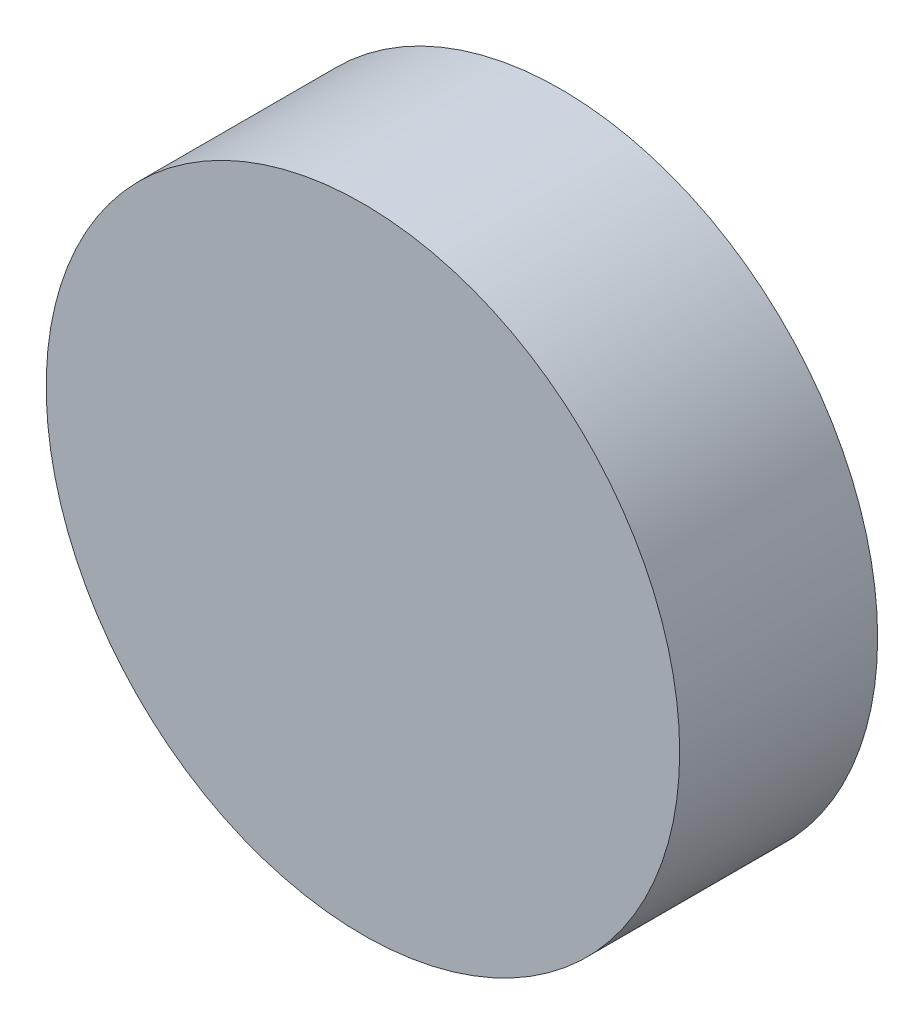
ISO-10303-21;
HEADER;
FILE_DESCRIPTION(('STEP AP214'),'2;1');
FILE_NAME('part.step','',(''),(''),'','','');
FILE_SCHEMA(('AUTOMOTIVE_DESIGN { 1 0 10303 214 1 1 1 1 }'));
ENDSEC;
DATA;
#1=APPLICATION_CONTEXT('core data for automotive mechanical design processes');
#2=APPLICATION_PROTOCOL_DEFINITION('international standard','automotive_design',2000,#1);
#3=PRODUCT_CONTEXT('',#1,'mechanical');
#4=PRODUCT('Part','Part','',(#3));
#5=PRODUCT_RELATED_PRODUCT_CATEGORY('part','',(#4));
#6=PRODUCT_DEFINITION_FORMATION('','',#4);
#7=PRODUCT_DEFINITION_CONTEXT('part definition',#1,'design');
#8=PRODUCT_DEFINITION('design','',#6,#7);
#9=PRODUCT_DEFINITION_SHAPE('','',#8);
#10=(LENGTH_UNIT() NAMED_UNIT(*) SI_UNIT(.MILLI.,.METRE.));
#11=(NAMED_UNIT(*) PLANE_ANGLE_UNIT() SI_UNIT($,.RADIAN.));
#12=(NAMED_UNIT(*) SI_UNIT($,.STERADIAN.) SOLID_ANGLE_UNIT());
#13=UNCERTAINTY_MEASURE_WITH_UNIT(LENGTH_MEASURE(1.E-05),#10,'distance_accuracy_value','');
#14=(GEOMETRIC_REPRESENTATION_CONTEXT(3) GLOBAL_UNCERTAINTY_ASSIGNED_CONTEXT((#13)) GLOBAL_UNIT_ASSIGNED_CONTEXT((#10,
#11,#12)) REPRESENTATION_CONTEXT('',''));
#15=CARTESIAN_POINT('',(0.,0.,0.));
#16=DIRECTION('',(0.,0.,1.));
#17=DIRECTION('',(1.,0.,0.));
#18=AXIS2_PLACEMENT_3D('',#15,#16,#17);
#19=CARTESIAN_POINT('',(0.,0.,5.));
#20=DIRECTION('',(0.,0.,-1.));
#21=DIRECTION('',(-1.,0.,0.));
#22=AXIS2_PLACEMENT_3D('',#19,#20,#21);
#23=CYLINDRICAL_SURFACE('',#22,8.);
#24=CARTESIAN_POINT('',(0.,0.,5.));
#25=DIRECTION('',(0.,0.,1.));
#26=DIRECTION('',(1.,0.,0.));
#27=AXIS2_PLACEMENT_3D('',#24,#25,#26);
#28=CIRCLE('',#27,8.);
#29=CARTESIAN_POINT('',(8.,0.,5.));
#30=VERTEX_POINT('',#29);
#31=EDGE_CURVE('E10',#30,#30,#28,.T.);
#32=ORIENTED_EDGE('',*,*,#31,.F.);
#33=EDGE_LOOP('',(#32));
#34=FACE_BOUND('',#33,.T.);
#35=CARTESIAN_POINT('',(0.,0.,0.));
#36=DIRECTION('',(0.,0.,1.));
#37=DIRECTION('',(1.,0.,0.));
#38=AXIS2_PLACEMENT_3D('',#35,#36,#37);
#39=CIRCLE('',#38,8.);
#40=CARTESIAN_POINT('',(8.,0.,0.));
#41=VERTEX_POINT('',#40);
#42=EDGE_CURVE('E40',#41,#41,#39,.T.);
#43=ORIENTED_EDGE('',*,*,#42,.T.);
#44=EDGE_LOOP('',(#43));
#45=FACE_BOUND('',#44,.T.);
#46=ADVANCED_FACE('F37',(#34,#45),#23,.T.);
#47=CARTESIAN_POINT('',(0.,0.,5.));
#48=DIRECTION('',(0.,0.,1.));
#49=DIRECTION('',(1.,0.,0.));
#50=AXIS2_PLACEMENT_3D('',#47,#48,#49);
#51=PLANE('',#50);
#52=ORIENTED_EDGE('',*,*,#31,.T.);
#53=EDGE_LOOP('',(#52));
#54=FACE_BOUND('',#53,.T.);
#55=ADVANCED_FACE('F52',(#54),#51,.T.);
#56=CARTESIAN_POINT('',(0.,0.,0.));
#57=DIRECTION('',(0.,0.,1.));
#58=DIRECTION('',(1.,0.,0.));
#59=AXIS2_PLACEMENT_3D('',#56,#57,#58);
#60=PLANE('',#59);
#61=ORIENTED_EDGE('',*,*,#42,.F.);
#62=EDGE_LOOP('',(#61));
#63=FACE_BOUND('',#62,.T.);
#64=ADVANCED_FACE('F50',(#63),#60,.F.);
#65=CLOSED_SHELL('',(#46,#55,#64));
#66=MANIFOLD_SOLID_BREP('B2',#65);
#67=ADVANCED_BREP_SHAPE_REPRESENTATION('',(#18,#66),#14);
#68=SHAPE_DEFINITION_REPRESENTATION(#9,#67);
ENDSEC;
END-ISO-10303-21;
